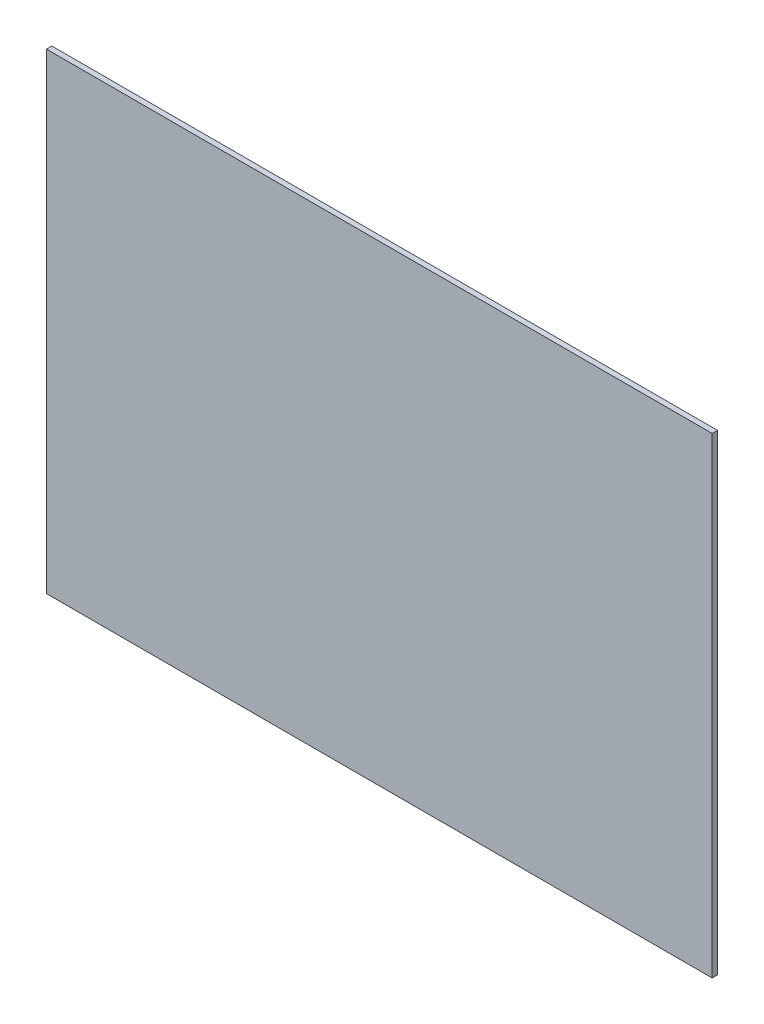
ISO-10303-21;
HEADER;
FILE_DESCRIPTION(('STEP AP214'),'2;1');
FILE_NAME('part.step','',(''),(''),'','','');
FILE_SCHEMA(('AUTOMOTIVE_DESIGN { 1 0 10303 214 1 1 1 1 }'));
ENDSEC;
DATA;
#1=APPLICATION_CONTEXT('core data for automotive mechanical design processes');
#2=APPLICATION_PROTOCOL_DEFINITION('international standard','automotive_design',2000,#1);
#3=PRODUCT_CONTEXT('',#1,'mechanical');
#4=PRODUCT('Part','Part','',(#3));
#5=PRODUCT_RELATED_PRODUCT_CATEGORY('part','',(#4));
#6=PRODUCT_DEFINITION_FORMATION('','',#4);
#7=PRODUCT_DEFINITION_CONTEXT('part definition',#1,'design');
#8=PRODUCT_DEFINITION('design','',#6,#7);
#9=PRODUCT_DEFINITION_SHAPE('','',#8);
#10=(LENGTH_UNIT() NAMED_UNIT(*) SI_UNIT(.MILLI.,.METRE.));
#11=(NAMED_UNIT(*) PLANE_ANGLE_UNIT() SI_UNIT($,.RADIAN.));
#12=(NAMED_UNIT(*) SI_UNIT($,.STERADIAN.) SOLID_ANGLE_UNIT());
#13=UNCERTAINTY_MEASURE_WITH_UNIT(LENGTH_MEASURE(1.E-05),#10,'distance_accuracy_value','');
#14=(GEOMETRIC_REPRESENTATION_CONTEXT(3) GLOBAL_UNCERTAINTY_ASSIGNED_CONTEXT((#13)) GLOBAL_UNIT_ASSIGNED_CONTEXT((#10,
#11,#12)) REPRESENTATION_CONTEXT('',''));
#15=CARTESIAN_POINT('',(0.,0.,0.));
#16=DIRECTION('',(0.,0.,1.));
#17=DIRECTION('',(1.,0.,0.));
#18=AXIS2_PLACEMENT_3D('',#15,#16,#17);
#19=CARTESIAN_POINT('',(-196.85,-139.446,1.5875));
#20=DIRECTION('',(0.,1.,0.));
#21=DIRECTION('',(0.,0.,1.));
#22=AXIS2_PLACEMENT_3D('',#19,#20,#21);
#23=PLANE('',#22);
#24=DIRECTION('',(1.,0.,0.));
#25=VECTOR('',#24,1.);
#26=CARTESIAN_POINT('',(-196.85,-139.446,-1.5875));
#27=LINE('',#26,#25);
#28=CARTESIAN_POINT('',(-196.85,-139.446,-1.5875));
#29=VERTEX_POINT('',#28);
#30=CARTESIAN_POINT('',(196.85,-139.446,-1.5875));
#31=VERTEX_POINT('',#30);
#32=EDGE_CURVE('E100',#29,#31,#27,.T.);
#33=ORIENTED_EDGE('',*,*,#32,.T.);
#34=DIRECTION('',(0.,0.,-1.));
#35=VECTOR('',#34,1.);
#36=CARTESIAN_POINT('',(196.85,-139.446,1.5875));
#37=LINE('',#36,#35);
#38=CARTESIAN_POINT('',(196.85,-139.446,1.5875));
#39=VERTEX_POINT('',#38);
#40=EDGE_CURVE('E11',#39,#31,#37,.T.);
#41=ORIENTED_EDGE('',*,*,#40,.F.);
#42=DIRECTION('',(1.,0.,0.));
#43=VECTOR('',#42,1.);
#44=CARTESIAN_POINT('',(-196.85,-139.446,1.5875));
#45=LINE('',#44,#43);
#46=CARTESIAN_POINT('',(-196.85,-139.446,1.5875));
#47=VERTEX_POINT('',#46);
#48=EDGE_CURVE('E88',#47,#39,#45,.T.);
#49=ORIENTED_EDGE('',*,*,#48,.F.);
#50=DIRECTION('',(0.,0.,-1.));
#51=VECTOR('',#50,1.);
#52=CARTESIAN_POINT('',(-196.85,-139.446,1.5875));
#53=LINE('',#52,#51);
#54=EDGE_CURVE('E96',#47,#29,#53,.T.);
#55=ORIENTED_EDGE('',*,*,#54,.T.);
#56=EDGE_LOOP('',(#33,#41,#49,#55));
#57=FACE_BOUND('',#56,.T.);
#58=ADVANCED_FACE('F37',(#57),#23,.F.);
#59=CARTESIAN_POINT('',(196.85,-139.446,1.5875));
#60=DIRECTION('',(-1.,0.,0.));
#61=DIRECTION('',(0.,0.,1.));
#62=AXIS2_PLACEMENT_3D('',#59,#60,#61);
#63=PLANE('',#62);
#64=DIRECTION('',(0.,1.,0.));
#65=VECTOR('',#64,1.);
#66=CARTESIAN_POINT('',(196.85,-139.446,-1.5875));
#67=LINE('',#66,#65);
#68=CARTESIAN_POINT('',(196.85,139.446,-1.5875));
#69=VERTEX_POINT('',#68);
#70=EDGE_CURVE('E92',#31,#69,#67,.T.);
#71=ORIENTED_EDGE('',*,*,#70,.T.);
#72=DIRECTION('',(0.,0.,-1.));
#73=VECTOR('',#72,1.);
#74=CARTESIAN_POINT('',(196.85,139.446,1.5875));
#75=LINE('',#74,#73);
#76=CARTESIAN_POINT('',(196.85,139.446,1.5875));
#77=VERTEX_POINT('',#76);
#78=EDGE_CURVE('E45',#77,#69,#75,.T.);
#79=ORIENTED_EDGE('',*,*,#78,.F.);
#80=DIRECTION('',(0.,1.,0.));
#81=VECTOR('',#80,1.);
#82=CARTESIAN_POINT('',(196.85,-139.446,1.5875));
#83=LINE('',#82,#81);
#84=EDGE_CURVE('E83',#39,#77,#83,.T.);
#85=ORIENTED_EDGE('',*,*,#84,.F.);
#86=ORIENTED_EDGE('',*,*,#40,.T.);
#87=EDGE_LOOP('',(#71,#79,#85,#86));
#88=FACE_BOUND('',#87,.T.);
#89=ADVANCED_FACE('F91',(#88),#63,.F.);
#90=CARTESIAN_POINT('',(-196.85,139.446,1.5875));
#91=DIRECTION('',(0.,-1.,0.));
#92=DIRECTION('',(0.,0.,-1.));
#93=AXIS2_PLACEMENT_3D('',#90,#91,#92);
#94=PLANE('',#93);
#95=DIRECTION('',(-1.,0.,0.));
#96=VECTOR('',#95,1.);
#97=CARTESIAN_POINT('',(-196.85,139.446,-1.5875));
#98=LINE('',#97,#96);
#99=CARTESIAN_POINT('',(-196.85,139.446,-1.5875));
#100=VERTEX_POINT('',#99);
#101=EDGE_CURVE('E70',#69,#100,#98,.T.);
#102=ORIENTED_EDGE('',*,*,#101,.T.);
#103=DIRECTION('',(0.,0.,-1.));
#104=VECTOR('',#103,1.);
#105=CARTESIAN_POINT('',(-196.85,139.446,1.5875));
#106=LINE('',#105,#104);
#107=CARTESIAN_POINT('',(-196.85,139.446,1.5875));
#108=VERTEX_POINT('',#107);
#109=EDGE_CURVE('E93',#108,#100,#106,.T.);
#110=ORIENTED_EDGE('',*,*,#109,.F.);
#111=DIRECTION('',(-1.,0.,0.));
#112=VECTOR('',#111,1.);
#113=CARTESIAN_POINT('',(-196.85,139.446,1.5875));
#114=LINE('',#113,#112);
#115=EDGE_CURVE('E86',#77,#108,#114,.T.);
#116=ORIENTED_EDGE('',*,*,#115,.F.);
#117=ORIENTED_EDGE('',*,*,#78,.T.);
#118=EDGE_LOOP('',(#102,#110,#116,#117));
#119=FACE_BOUND('',#118,.T.);
#120=ADVANCED_FACE('F94',(#119),#94,.F.);
#121=CARTESIAN_POINT('',(-196.85,-139.446,1.5875));
#122=DIRECTION('',(1.,0.,0.));
#123=DIRECTION('',(0.,0.,-1.));
#124=AXIS2_PLACEMENT_3D('',#121,#122,#123);
#125=PLANE('',#124);
#126=DIRECTION('',(0.,-1.,0.));
#127=VECTOR('',#126,1.);
#128=CARTESIAN_POINT('',(-196.85,-139.446,-1.5875));
#129=LINE('',#128,#127);
#130=EDGE_CURVE('E76',#100,#29,#129,.T.);
#131=ORIENTED_EDGE('',*,*,#130,.T.);
#132=ORIENTED_EDGE('',*,*,#54,.F.);
#133=DIRECTION('',(0.,-1.,0.));
#134=VECTOR('',#133,1.);
#135=CARTESIAN_POINT('',(-196.85,-139.446,1.5875));
#136=LINE('',#135,#134);
#137=EDGE_CURVE('E53',#108,#47,#136,.T.);
#138=ORIENTED_EDGE('',*,*,#137,.F.);
#139=ORIENTED_EDGE('',*,*,#109,.T.);
#140=EDGE_LOOP('',(#131,#132,#138,#139));
#141=FACE_BOUND('',#140,.T.);
#142=ADVANCED_FACE('F107',(#141),#125,.F.);
#143=CARTESIAN_POINT('',(0.,0.,1.5875));
#144=DIRECTION('',(0.,0.,1.));
#145=DIRECTION('',(1.,0.,0.));
#146=AXIS2_PLACEMENT_3D('',#143,#144,#145);
#147=PLANE('',#146);
#148=ORIENTED_EDGE('',*,*,#48,.T.);
#149=ORIENTED_EDGE('',*,*,#84,.T.);
#150=ORIENTED_EDGE('',*,*,#115,.T.);
#151=ORIENTED_EDGE('',*,*,#137,.T.);
#152=EDGE_LOOP('',(#148,#149,#150,#151));
#153=FACE_BOUND('',#152,.T.);
#154=ADVANCED_FACE('F84',(#153),#147,.T.);
#155=CARTESIAN_POINT('',(0.,0.,-1.5875));
#156=DIRECTION('',(0.,0.,1.));
#157=DIRECTION('',(1.,0.,0.));
#158=AXIS2_PLACEMENT_3D('',#155,#156,#157);
#159=PLANE('',#158);
#160=ORIENTED_EDGE('',*,*,#32,.F.);
#161=ORIENTED_EDGE('',*,*,#130,.F.);
#162=ORIENTED_EDGE('',*,*,#101,.F.);
#163=ORIENTED_EDGE('',*,*,#70,.F.);
#164=EDGE_LOOP('',(#160,#161,#162,#163));
#165=FACE_BOUND('',#164,.T.);
#166=ADVANCED_FACE('F110',(#165),#159,.F.);
#167=CLOSED_SHELL('',(#58,#89,#120,#142,#154,#166));
#168=MANIFOLD_SOLID_BREP('B2',#167);
#169=ADVANCED_BREP_SHAPE_REPRESENTATION('',(#18,#168),#14);
#170=SHAPE_DEFINITION_REPRESENTATION(#9,#169);
ENDSEC;
END-ISO-10303-21;
